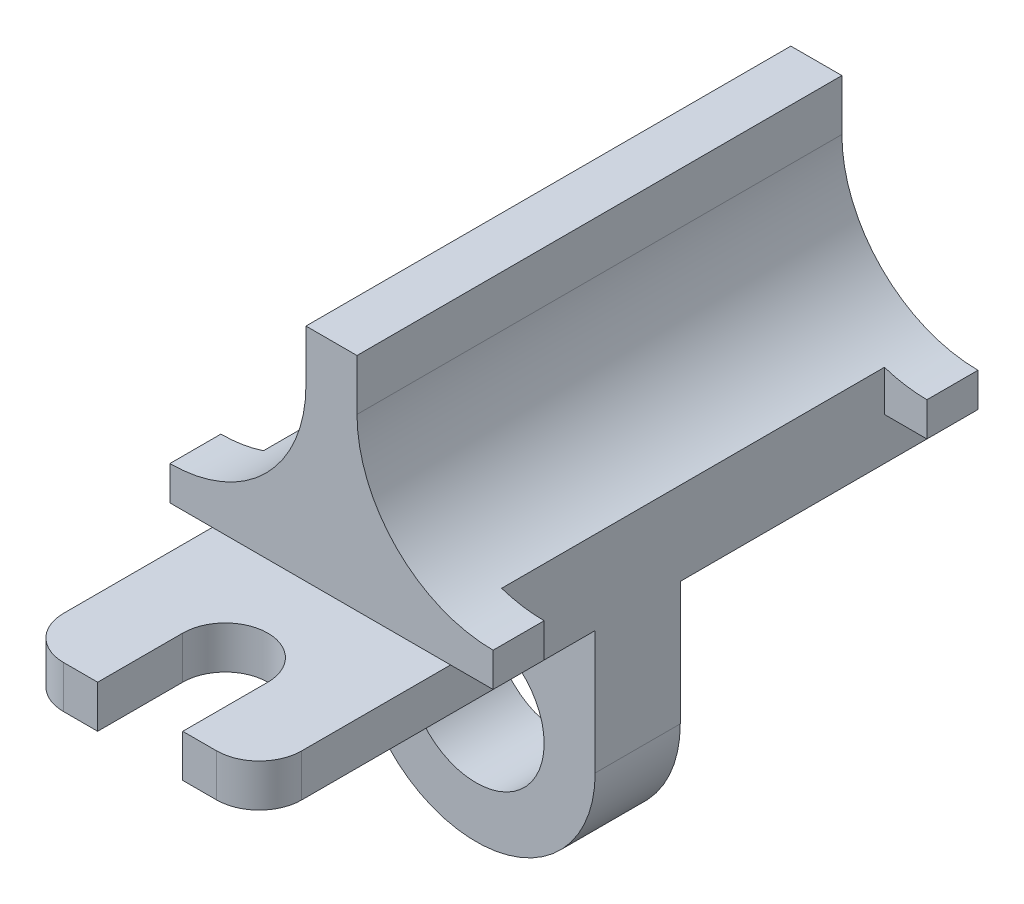
ISO-10303-21;
HEADER;
FILE_DESCRIPTION(('STEP AP214'),'2;1');
FILE_NAME('part.step','',(''),(''),'','','');
FILE_SCHEMA(('AUTOMOTIVE_DESIGN { 1 0 10303 214 1 1 1 1 }'));
ENDSEC;
DATA;
#1=APPLICATION_CONTEXT('core data for automotive mechanical design processes');
#2=APPLICATION_PROTOCOL_DEFINITION('international standard','automotive_design',2000,#1);
#3=PRODUCT_CONTEXT('',#1,'mechanical');
#4=PRODUCT('Part','Part','',(#3));
#5=PRODUCT_RELATED_PRODUCT_CATEGORY('part','',(#4));
#6=PRODUCT_DEFINITION_FORMATION('','',#4);
#7=PRODUCT_DEFINITION_CONTEXT('part definition',#1,'design');
#8=PRODUCT_DEFINITION('design','',#6,#7);
#9=PRODUCT_DEFINITION_SHAPE('','',#8);
#10=(LENGTH_UNIT() NAMED_UNIT(*) SI_UNIT(.MILLI.,.METRE.));
#11=(NAMED_UNIT(*) PLANE_ANGLE_UNIT() SI_UNIT($,.RADIAN.));
#12=(NAMED_UNIT(*) SI_UNIT($,.STERADIAN.) SOLID_ANGLE_UNIT());
#13=UNCERTAINTY_MEASURE_WITH_UNIT(LENGTH_MEASURE(1.E-05),#10,'distance_accuracy_value','');
#14=(GEOMETRIC_REPRESENTATION_CONTEXT(3) GLOBAL_UNCERTAINTY_ASSIGNED_CONTEXT((#13)) GLOBAL_UNIT_ASSIGNED_CONTEXT((#10,
#11,#12)) REPRESENTATION_CONTEXT('',''));
#15=CARTESIAN_POINT('',(0.,0.,0.));
#16=DIRECTION('',(0.,0.,1.));
#17=DIRECTION('',(1.,0.,0.));
#18=AXIS2_PLACEMENT_3D('',#15,#16,#17);
#19=CARTESIAN_POINT('',(66.,39.,-70.));
#20=DIRECTION('',(0.,-1.,0.));
#21=DIRECTION('',(1.,0.,0.));
#22=AXIS2_PLACEMENT_3D('',#19,#20,#21);
#23=PLANE('',#22);
#24=DIRECTION('',(-1.,0.,0.));
#25=VECTOR('',#24,1.);
#26=CARTESIAN_POINT('',(56.,39.,32.));
#27=LINE('',#26,#25);
#28=CARTESIAN_POINT('',(66.,39.,32.));
#29=VERTEX_POINT('',#28);
#30=CARTESIAN_POINT('',(56.,39.,32.));
#31=VERTEX_POINT('',#30);
#32=EDGE_CURVE('E442',#29,#31,#27,.T.);
#33=ORIENTED_EDGE('',*,*,#32,.F.);
#34=DIRECTION('',(0.,0.,1.));
#35=VECTOR('',#34,1.);
#36=CARTESIAN_POINT('',(66.,39.,-70.));
#37=LINE('',#36,#35);
#38=CARTESIAN_POINT('',(66.,39.,44.));
#39=VERTEX_POINT('',#38);
#40=EDGE_CURVE('E429',#29,#39,#37,.T.);
#41=ORIENTED_EDGE('',*,*,#40,.T.);
#42=DIRECTION('',(1.,0.,0.));
#43=VECTOR('',#42,1.);
#44=CARTESIAN_POINT('',(66.,39.,44.));
#45=LINE('',#44,#43);
#46=CARTESIAN_POINT('',(56.,39.,44.));
#47=VERTEX_POINT('',#46);
#48=EDGE_CURVE('E402',#47,#39,#45,.T.);
#49=ORIENTED_EDGE('',*,*,#48,.F.);
#50=DIRECTION('',(0.,0.,1.));
#51=VECTOR('',#50,1.);
#52=CARTESIAN_POINT('',(56.,39.,-70.));
#53=LINE('',#52,#51);
#54=EDGE_CURVE('E299',#31,#47,#53,.T.);
#55=ORIENTED_EDGE('',*,*,#54,.F.);
#56=EDGE_LOOP('',(#33,#41,#49,#55));
#57=FACE_BOUND('',#56,.T.);
#58=ADVANCED_FACE('F32',(#57),#23,.T.);
#59=CARTESIAN_POINT('',(66.,39.,-70.));
#60=DIRECTION('',(1.,0.,0.));
#61=DIRECTION('',(0.,0.,-1.));
#62=AXIS2_PLACEMENT_3D('',#59,#60,#61);
#63=PLANE('',#62);
#64=DIRECTION('',(0.,-1.,0.));
#65=VECTOR('',#64,1.);
#66=CARTESIAN_POINT('',(66.,91.001,32.));
#67=LINE('',#66,#65);
#68=CARTESIAN_POINT('',(66.,47.,32.));
#69=VERTEX_POINT('',#68);
#70=EDGE_CURVE('E452',#69,#29,#67,.T.);
#71=ORIENTED_EDGE('',*,*,#70,.F.);
#72=DIRECTION('',(0.,0.,1.));
#73=VECTOR('',#72,1.);
#74=CARTESIAN_POINT('',(66.,47.,-70.));
#75=LINE('',#74,#73);
#76=CARTESIAN_POINT('',(66.,47.,44.));
#77=VERTEX_POINT('',#76);
#78=EDGE_CURVE('E274',#69,#77,#75,.T.);
#79=ORIENTED_EDGE('',*,*,#78,.T.);
#80=DIRECTION('',(0.,1.,0.));
#81=VECTOR('',#80,1.);
#82=CARTESIAN_POINT('',(66.,39.,44.));
#83=LINE('',#82,#81);
#84=EDGE_CURVE('E380',#39,#77,#83,.T.);
#85=ORIENTED_EDGE('',*,*,#84,.F.);
#86=ORIENTED_EDGE('',*,*,#40,.F.);
#87=EDGE_LOOP('',(#71,#79,#85,#86));
#88=FACE_BOUND('',#87,.T.);
#89=ADVANCED_FACE('F449',(#88),#63,.T.);
#90=DIRECTION('',(-1.,0.,0.));
#91=VECTOR('',#90,1.);
#92=CARTESIAN_POINT('',(-10.,39.,32.));
#93=LINE('',#92,#91);
#94=CARTESIAN_POINT('',(0.,39.,32.));
#95=VERTEX_POINT('',#94);
#96=CARTESIAN_POINT('',(-10.,39.,32.));
#97=VERTEX_POINT('',#96);
#98=EDGE_CURVE('E250',#95,#97,#93,.T.);
#99=ORIENTED_EDGE('',*,*,#98,.F.);
#100=DIRECTION('',(0.,0.,1.));
#101=VECTOR('',#100,1.);
#102=CARTESIAN_POINT('',(0.,39.,-70.));
#103=LINE('',#102,#101);
#104=CARTESIAN_POINT('',(0.,39.,44.));
#105=VERTEX_POINT('',#104);
#106=EDGE_CURVE('E294',#95,#105,#103,.T.);
#107=ORIENTED_EDGE('',*,*,#106,.T.);
#108=CARTESIAN_POINT('',(-10.,39.,44.));
#109=VERTEX_POINT('',#108);
#110=EDGE_CURVE('E403',#109,#105,#45,.T.);
#111=ORIENTED_EDGE('',*,*,#110,.F.);
#112=DIRECTION('',(0.,0.,1.));
#113=VECTOR('',#112,1.);
#114=CARTESIAN_POINT('',(-10.,39.,-70.));
#115=LINE('',#114,#113);
#116=EDGE_CURVE('E257',#97,#109,#115,.T.);
#117=ORIENTED_EDGE('',*,*,#116,.F.);
#118=EDGE_LOOP('',(#99,#107,#111,#117));
#119=FACE_BOUND('',#118,.T.);
#120=ADVANCED_FACE('F483',(#119),#23,.T.);
#121=CARTESIAN_POINT('',(-10.,39.,-70.));
#122=DIRECTION('',(-1.,0.,0.));
#123=DIRECTION('',(0.,-1.,0.));
#124=AXIS2_PLACEMENT_3D('',#121,#122,#123);
#125=PLANE('',#124);
#126=DIRECTION('',(0.,-1.,0.));
#127=VECTOR('',#126,1.);
#128=CARTESIAN_POINT('',(-10.,91.001,32.));
#129=LINE('',#128,#127);
#130=CARTESIAN_POINT('',(-10.,47.,32.));
#131=VERTEX_POINT('',#130);
#132=EDGE_CURVE('E241',#131,#97,#129,.T.);
#133=ORIENTED_EDGE('',*,*,#132,.T.);
#134=ORIENTED_EDGE('',*,*,#116,.T.);
#135=DIRECTION('',(0.,-1.,0.));
#136=VECTOR('',#135,1.);
#137=CARTESIAN_POINT('',(-10.,39.,44.));
#138=LINE('',#137,#136);
#139=CARTESIAN_POINT('',(-10.,47.,44.));
#140=VERTEX_POINT('',#139);
#141=EDGE_CURVE('E399',#140,#109,#138,.T.);
#142=ORIENTED_EDGE('',*,*,#141,.F.);
#143=DIRECTION('',(0.,0.,1.));
#144=VECTOR('',#143,1.);
#145=CARTESIAN_POINT('',(-10.,47.,-70.));
#146=LINE('',#145,#144);
#147=EDGE_CURVE('E258',#131,#140,#146,.T.);
#148=ORIENTED_EDGE('',*,*,#147,.F.);
#149=EDGE_LOOP('',(#133,#134,#142,#148));
#150=FACE_BOUND('',#149,.T.);
#151=ADVANCED_FACE('F478',(#150),#125,.T.);
#152=CARTESIAN_POINT('',(0.,0.,89.));
#153=DIRECTION('',(0.,0.,1.));
#154=DIRECTION('',(1.,0.,0.));
#155=AXIS2_PLACEMENT_3D('',#152,#153,#154);
#156=PLANE('',#155);
#157=DIRECTION('',(1.,0.,0.));
#158=VECTOR('',#157,1.);
#159=CARTESIAN_POINT('',(0.,29.,89.));
#160=LINE('',#159,#158);
#161=CARTESIAN_POINT('',(38.0334699329501,29.,89.));
#162=VERTEX_POINT('',#161);
#163=CARTESIAN_POINT('',(46.,29.,89.));
#164=VERTEX_POINT('',#163);
#165=EDGE_CURVE('E278',#162,#164,#160,.T.);
#166=ORIENTED_EDGE('',*,*,#165,.T.);
#167=DIRECTION('',(0.,-1.,0.));
#168=VECTOR('',#167,1.);
#169=CARTESIAN_POINT('',(46.,39.,89.));
#170=LINE('',#169,#168);
#171=CARTESIAN_POINT('',(46.,39.,89.));
#172=VERTEX_POINT('',#171);
#173=EDGE_CURVE('E315',#164,#172,#170,.F.);
#174=ORIENTED_EDGE('',*,*,#173,.T.);
#175=DIRECTION('',(1.,0.,0.));
#176=VECTOR('',#175,1.);
#177=CARTESIAN_POINT('',(0.,39.,89.));
#178=LINE('',#177,#176);
#179=CARTESIAN_POINT('',(38.0334699329501,39.,89.));
#180=VERTEX_POINT('',#179);
#181=EDGE_CURVE('E277',#180,#172,#178,.T.);
#182=ORIENTED_EDGE('',*,*,#181,.F.);
#183=DIRECTION('',(0.,1.,0.));
#184=VECTOR('',#183,1.);
#185=CARTESIAN_POINT('',(38.0334699329501,-28.001,89.));
#186=LINE('',#185,#184);
#187=EDGE_CURVE('E347',#162,#180,#186,.T.);
#188=ORIENTED_EDGE('',*,*,#187,.F.);
#189=EDGE_LOOP('',(#166,#174,#182,#188));
#190=FACE_BOUND('',#189,.T.);
#191=ADVANCED_FACE('F576',(#190),#156,.T.);
#192=CARTESIAN_POINT('',(0.,29.,-70.));
#193=DIRECTION('',(0.,-1.,0.));
#194=DIRECTION('',(0.,0.,-1.));
#195=AXIS2_PLACEMENT_3D('',#192,#193,#194);
#196=PLANE('',#195);
#197=DIRECTION('',(0.,0.,1.));
#198=VECTOR('',#197,1.);
#199=CARTESIAN_POINT('',(56.,29.,-70.));
#200=LINE('',#199,#198);
#201=CARTESIAN_POINT('',(56.,29.,-70.));
#202=VERTEX_POINT('',#201);
#203=CARTESIAN_POINT('',(56.,29.,-10.));
#204=VERTEX_POINT('',#203);
#205=EDGE_CURVE('E301',#202,#204,#200,.T.);
#206=ORIENTED_EDGE('',*,*,#205,.T.);
#207=DIRECTION('',(-1.,0.,0.));
#208=VECTOR('',#207,1.);
#209=CARTESIAN_POINT('',(0.,29.,-10.));
#210=LINE('',#209,#208);
#211=CARTESIAN_POINT('',(0.,29.,-10.));
#212=VERTEX_POINT('',#211);
#213=EDGE_CURVE('E371',#204,#212,#210,.T.);
#214=ORIENTED_EDGE('',*,*,#213,.T.);
#215=DIRECTION('',(0.,0.,1.));
#216=VECTOR('',#215,1.);
#217=CARTESIAN_POINT('',(0.,29.,-70.));
#218=LINE('',#217,#216);
#219=CARTESIAN_POINT('',(0.,29.,-70.));
#220=VERTEX_POINT('',#219);
#221=EDGE_CURVE('E305',#220,#212,#218,.T.);
#222=ORIENTED_EDGE('',*,*,#221,.F.);
#223=DIRECTION('',(1.,0.,0.));
#224=VECTOR('',#223,1.);
#225=CARTESIAN_POINT('',(0.,29.,-70.));
#226=LINE('',#225,#224);
#227=EDGE_CURVE('E284',#220,#202,#226,.T.);
#228=ORIENTED_EDGE('',*,*,#227,.T.);
#229=EDGE_LOOP('',(#206,#214,#222,#228));
#230=FACE_BOUND('',#229,.T.);
#231=ADVANCED_FACE('F642',(#230),#196,.T.);
#232=CARTESIAN_POINT('',(0.,39.,-70.));
#233=DIRECTION('',(0.,-1.,0.));
#234=DIRECTION('',(0.,0.,-1.));
#235=AXIS2_PLACEMENT_3D('',#232,#233,#234);
#236=PLANE('',#235);
#237=ORIENTED_EDGE('',*,*,#181,.T.);
#238=CARTESIAN_POINT('',(46.,39.,79.));
#239=DIRECTION('',(0.,-1.,0.));
#240=DIRECTION('',(0.,0.,-1.));
#241=AXIS2_PLACEMENT_3D('',#238,#239,#240);
#242=CIRCLE('',#241,10.);
#243=CARTESIAN_POINT('',(56.,39.,79.));
#244=VERTEX_POINT('',#243);
#245=EDGE_CURVE('E319',#172,#244,#242,.F.);
#246=ORIENTED_EDGE('',*,*,#245,.T.);
#247=EDGE_CURVE('E300',#47,#244,#53,.T.);
#248=ORIENTED_EDGE('',*,*,#247,.F.);
#249=EDGE_CURVE('E293',#105,#47,#45,.T.);
#250=ORIENTED_EDGE('',*,*,#249,.F.);
#251=CARTESIAN_POINT('',(0.,39.,79.));
#252=VERTEX_POINT('',#251);
#253=EDGE_CURVE('E295',#105,#252,#103,.T.);
#254=ORIENTED_EDGE('',*,*,#253,.T.);
#255=CARTESIAN_POINT('',(10.,39.,79.));
#256=DIRECTION('',(0.,-1.,0.));
#257=DIRECTION('',(0.,0.,-1.));
#258=AXIS2_PLACEMENT_3D('',#255,#256,#257);
#259=CIRCLE('',#258,10.);
#260=CARTESIAN_POINT('',(10.,39.,89.));
#261=VERTEX_POINT('',#260);
#262=EDGE_CURVE('E317',#252,#261,#259,.F.);
#263=ORIENTED_EDGE('',*,*,#262,.T.);
#264=CARTESIAN_POINT('',(18.0334699329501,39.,89.));
#265=VERTEX_POINT('',#264);
#266=EDGE_CURVE('E279',#261,#265,#178,.T.);
#267=ORIENTED_EDGE('',*,*,#266,.T.);
#268=DIRECTION('',(0.,0.,1.));
#269=VECTOR('',#268,1.);
#270=CARTESIAN_POINT('',(18.0334699329501,39.,89.));
#271=LINE('',#270,#269);
#272=CARTESIAN_POINT('',(18.0334699329501,39.,69.));
#273=VERTEX_POINT('',#272);
#274=EDGE_CURVE('E500',#273,#265,#271,.T.);
#275=ORIENTED_EDGE('',*,*,#274,.F.);
#276=CARTESIAN_POINT('',(28.0334699329501,39.,69.));
#277=DIRECTION('',(0.,1.,0.));
#278=DIRECTION('',(0.,0.,1.));
#279=AXIS2_PLACEMENT_3D('',#276,#277,#278);
#280=CIRCLE('',#279,10.);
#281=CARTESIAN_POINT('',(38.0334699329501,39.,69.));
#282=VERTEX_POINT('',#281);
#283=EDGE_CURVE('E505',#282,#273,#280,.T.);
#284=ORIENTED_EDGE('',*,*,#283,.F.);
#285=DIRECTION('',(0.,0.,-1.));
#286=VECTOR('',#285,1.);
#287=CARTESIAN_POINT('',(38.0334699329501,39.,69.));
#288=LINE('',#287,#286);
#289=EDGE_CURVE('E504',#180,#282,#288,.T.);
#290=ORIENTED_EDGE('',*,*,#289,.F.);
#291=EDGE_LOOP('',(#237,#246,#248,#250,#254,#263,#267,#275,#284,#290));
#292=FACE_BOUND('',#291,.T.);
#293=ADVANCED_FACE('F492',(#292),#236,.F.);
#294=CARTESIAN_POINT('',(0.,39.,-70.));
#295=DIRECTION('',(-1.,0.,0.));
#296=DIRECTION('',(0.,0.,1.));
#297=AXIS2_PLACEMENT_3D('',#294,#295,#296);
#298=PLANE('',#297);
#299=CARTESIAN_POINT('',(0.,29.,10.));
#300=VERTEX_POINT('',#299);
#301=CARTESIAN_POINT('',(0.,29.,79.));
#302=VERTEX_POINT('',#301);
#303=EDGE_CURVE('E289',#300,#302,#218,.T.);
#304=ORIENTED_EDGE('',*,*,#303,.T.);
#305=DIRECTION('',(0.,-1.,0.));
#306=VECTOR('',#305,1.);
#307=CARTESIAN_POINT('',(0.,39.,79.));
#308=LINE('',#307,#306);
#309=EDGE_CURVE('E11',#302,#252,#308,.F.);
#310=ORIENTED_EDGE('',*,*,#309,.T.);
#311=ORIENTED_EDGE('',*,*,#253,.F.);
#312=ORIENTED_EDGE('',*,*,#106,.F.);
#313=DIRECTION('',(0.,-1.,0.));
#314=VECTOR('',#313,1.);
#315=CARTESIAN_POINT('',(0.,91.001,32.));
#316=LINE('',#315,#314);
#317=CARTESIAN_POINT('',(0.,48.6026316928587,32.));
#318=VERTEX_POINT('',#317);
#319=EDGE_CURVE('E533',#318,#95,#316,.T.);
#320=ORIENTED_EDGE('',*,*,#319,.F.);
#321=DIRECTION('',(0.,0.,1.));
#322=VECTOR('',#321,1.);
#323=CARTESIAN_POINT('',(0.,48.6026316928587,-70.));
#324=LINE('',#323,#322);
#325=CARTESIAN_POINT('',(0.,48.6026316928587,-58.));
#326=VERTEX_POINT('',#325);
#327=EDGE_CURVE('E517',#326,#318,#324,.T.);
#328=ORIENTED_EDGE('',*,*,#327,.F.);
#329=DIRECTION('',(0.,-1.,0.));
#330=VECTOR('',#329,1.);
#331=CARTESIAN_POINT('',(0.,91.001,-58.));
#332=LINE('',#331,#330);
#333=CARTESIAN_POINT('',(0.,39.,-58.));
#334=VERTEX_POINT('',#333);
#335=EDGE_CURVE('E47',#326,#334,#332,.T.);
#336=ORIENTED_EDGE('',*,*,#335,.T.);
#337=CARTESIAN_POINT('',(0.,39.,-70.));
#338=VERTEX_POINT('',#337);
#339=EDGE_CURVE('E290',#338,#334,#103,.T.);
#340=ORIENTED_EDGE('',*,*,#339,.F.);
#341=DIRECTION('',(0.,-1.,0.));
#342=VECTOR('',#341,1.);
#343=CARTESIAN_POINT('',(0.,39.,-70.));
#344=LINE('',#343,#342);
#345=EDGE_CURVE('E281',#338,#220,#344,.T.);
#346=ORIENTED_EDGE('',*,*,#345,.T.);
#347=ORIENTED_EDGE('',*,*,#221,.T.);
#348=DIRECTION('',(0.,-1.,0.));
#349=VECTOR('',#348,1.);
#350=CARTESIAN_POINT('',(0.,0.,-10.));
#351=LINE('',#350,#349);
#352=CARTESIAN_POINT('',(0.,0.,-10.));
#353=VERTEX_POINT('',#352);
#354=EDGE_CURVE('E374',#212,#353,#351,.T.);
#355=ORIENTED_EDGE('',*,*,#354,.T.);
#356=DIRECTION('',(0.,0.,1.));
#357=VECTOR('',#356,1.);
#358=CARTESIAN_POINT('',(0.,0.,-10.));
#359=LINE('',#358,#357);
#360=CARTESIAN_POINT('',(0.,0.,10.));
#361=VERTEX_POINT('',#360);
#362=EDGE_CURVE('E378',#353,#361,#359,.T.);
#363=ORIENTED_EDGE('',*,*,#362,.T.);
#364=DIRECTION('',(0.,-1.,0.));
#365=VECTOR('',#364,1.);
#366=CARTESIAN_POINT('',(0.,0.,10.));
#367=LINE('',#366,#365);
#368=EDGE_CURVE('E359',#300,#361,#367,.T.);
#369=ORIENTED_EDGE('',*,*,#368,.F.);
#370=EDGE_LOOP('',(#304,#310,#311,#312,#320,#328,#336,#340,#346,#347,#355,#363,#369));
#371=FACE_BOUND('',#370,.T.);
#372=ADVANCED_FACE('F494',(#371),#298,.T.);
#373=CARTESIAN_POINT('',(56.,39.,-70.));
#374=DIRECTION('',(-1.,0.,0.));
#375=DIRECTION('',(0.,0.,1.));
#376=AXIS2_PLACEMENT_3D('',#373,#374,#375);
#377=PLANE('',#376);
#378=ORIENTED_EDGE('',*,*,#247,.T.);
#379=DIRECTION('',(0.,-1.,0.));
#380=VECTOR('',#379,1.);
#381=CARTESIAN_POINT('',(56.,29.,79.));
#382=LINE('',#381,#380);
#383=CARTESIAN_POINT('',(56.,29.,79.));
#384=VERTEX_POINT('',#383);
#385=EDGE_CURVE('E308',#244,#384,#382,.T.);
#386=ORIENTED_EDGE('',*,*,#385,.T.);
#387=CARTESIAN_POINT('',(56.,29.,10.));
#388=VERTEX_POINT('',#387);
#389=EDGE_CURVE('E304',#388,#384,#200,.T.);
#390=ORIENTED_EDGE('',*,*,#389,.F.);
#391=DIRECTION('',(0.,1.,0.));
#392=VECTOR('',#391,1.);
#393=CARTESIAN_POINT('',(56.,29.,10.));
#394=LINE('',#393,#392);
#395=CARTESIAN_POINT('',(56.,0.,10.));
#396=VERTEX_POINT('',#395);
#397=EDGE_CURVE('E355',#396,#388,#394,.T.);
#398=ORIENTED_EDGE('',*,*,#397,.F.);
#399=DIRECTION('',(0.,0.,1.));
#400=VECTOR('',#399,1.);
#401=CARTESIAN_POINT('',(56.,0.,-10.));
#402=LINE('',#401,#400);
#403=CARTESIAN_POINT('',(56.,0.,-10.));
#404=VERTEX_POINT('',#403);
#405=EDGE_CURVE('E377',#404,#396,#402,.T.);
#406=ORIENTED_EDGE('',*,*,#405,.F.);
#407=DIRECTION('',(0.,1.,0.));
#408=VECTOR('',#407,1.);
#409=CARTESIAN_POINT('',(56.,29.,-10.));
#410=LINE('',#409,#408);
#411=EDGE_CURVE('E368',#404,#204,#410,.T.);
#412=ORIENTED_EDGE('',*,*,#411,.T.);
#413=ORIENTED_EDGE('',*,*,#205,.F.);
#414=DIRECTION('',(0.,-1.,0.));
#415=VECTOR('',#414,1.);
#416=CARTESIAN_POINT('',(56.,39.,-70.));
#417=LINE('',#416,#415);
#418=CARTESIAN_POINT('',(56.,39.,-70.));
#419=VERTEX_POINT('',#418);
#420=EDGE_CURVE('E287',#419,#202,#417,.T.);
#421=ORIENTED_EDGE('',*,*,#420,.F.);
#422=CARTESIAN_POINT('',(56.,39.,-58.));
#423=VERTEX_POINT('',#422);
#424=EDGE_CURVE('E296',#419,#423,#53,.T.);
#425=ORIENTED_EDGE('',*,*,#424,.T.);
#426=DIRECTION('',(0.,-1.,0.));
#427=VECTOR('',#426,1.);
#428=CARTESIAN_POINT('',(56.,91.001,-58.));
#429=LINE('',#428,#427);
#430=CARTESIAN_POINT('',(56.,48.6026316928587,-58.));
#431=VERTEX_POINT('',#430);
#432=EDGE_CURVE('E519',#431,#423,#429,.T.);
#433=ORIENTED_EDGE('',*,*,#432,.F.);
#434=DIRECTION('',(0.,0.,1.));
#435=VECTOR('',#434,1.);
#436=CARTESIAN_POINT('',(56.,48.6026316928587,-70.));
#437=LINE('',#436,#435);
#438=CARTESIAN_POINT('',(56.,48.6026316928587,32.));
#439=VERTEX_POINT('',#438);
#440=EDGE_CURVE('E529',#439,#431,#437,.F.);
#441=ORIENTED_EDGE('',*,*,#440,.F.);
#442=DIRECTION('',(0.,-1.,0.));
#443=VECTOR('',#442,1.);
#444=CARTESIAN_POINT('',(56.,91.001,32.));
#445=LINE('',#444,#443);
#446=EDGE_CURVE('E518',#439,#31,#445,.T.);
#447=ORIENTED_EDGE('',*,*,#446,.T.);
#448=ORIENTED_EDGE('',*,*,#54,.T.);
#449=EDGE_LOOP('',(#378,#386,#390,#398,#406,#412,#413,#421,#425,#433,#441,#447,#448));
#450=FACE_BOUND('',#449,.T.);
#451=ADVANCED_FACE('F581',(#450),#377,.F.);
#452=ORIENTED_EDGE('',*,*,#389,.T.);
#453=CARTESIAN_POINT('',(46.,29.,79.));
#454=DIRECTION('',(0.,-1.,0.));
#455=DIRECTION('',(0.,0.,-1.));
#456=AXIS2_PLACEMENT_3D('',#453,#454,#455);
#457=CIRCLE('',#456,10.);
#458=EDGE_CURVE('E313',#384,#164,#457,.T.);
#459=ORIENTED_EDGE('',*,*,#458,.T.);
#460=ORIENTED_EDGE('',*,*,#165,.F.);
#461=DIRECTION('',(0.,0.,-1.));
#462=VECTOR('',#461,1.);
#463=CARTESIAN_POINT('',(38.0334699329501,29.,69.));
#464=LINE('',#463,#462);
#465=CARTESIAN_POINT('',(38.0334699329501,29.,69.));
#466=VERTEX_POINT('',#465);
#467=EDGE_CURVE('E512',#162,#466,#464,.T.);
#468=ORIENTED_EDGE('',*,*,#467,.T.);
#469=CARTESIAN_POINT('',(28.0334699329501,29.,69.));
#470=DIRECTION('',(0.,-1.,0.));
#471=DIRECTION('',(0.,0.,-1.));
#472=AXIS2_PLACEMENT_3D('',#469,#470,#471);
#473=CIRCLE('',#472,10.);
#474=CARTESIAN_POINT('',(18.0334699329501,29.,69.));
#475=VERTEX_POINT('',#474);
#476=EDGE_CURVE('E240',#466,#475,#473,.F.);
#477=ORIENTED_EDGE('',*,*,#476,.T.);
#478=DIRECTION('',(0.,0.,1.));
#479=VECTOR('',#478,1.);
#480=CARTESIAN_POINT('',(18.0334699329501,29.,89.));
#481=LINE('',#480,#479);
#482=CARTESIAN_POINT('',(18.0334699329501,29.,89.));
#483=VERTEX_POINT('',#482);
#484=EDGE_CURVE('E337',#475,#483,#481,.T.);
#485=ORIENTED_EDGE('',*,*,#484,.T.);
#486=CARTESIAN_POINT('',(10.,29.,89.));
#487=VERTEX_POINT('',#486);
#488=EDGE_CURVE('E275',#487,#483,#160,.T.);
#489=ORIENTED_EDGE('',*,*,#488,.F.);
#490=CARTESIAN_POINT('',(10.,29.,79.));
#491=DIRECTION('',(0.,-1.,0.));
#492=DIRECTION('',(0.,0.,-1.));
#493=AXIS2_PLACEMENT_3D('',#490,#491,#492);
#494=CIRCLE('',#493,10.);
#495=EDGE_CURVE('E311',#487,#302,#494,.T.);
#496=ORIENTED_EDGE('',*,*,#495,.T.);
#497=ORIENTED_EDGE('',*,*,#303,.F.);
#498=DIRECTION('',(-1.,0.,0.));
#499=VECTOR('',#498,1.);
#500=CARTESIAN_POINT('',(0.,29.,10.));
#501=LINE('',#500,#499);
#502=EDGE_CURVE('E357',#388,#300,#501,.T.);
#503=ORIENTED_EDGE('',*,*,#502,.F.);
#504=EDGE_LOOP('',(#452,#459,#460,#468,#477,#485,#489,#496,#497,#503));
#505=FACE_BOUND('',#504,.T.);
#506=ADVANCED_FACE('F333',(#505),#196,.T.);
#507=CARTESIAN_POINT('',(0.,0.,-70.));
#508=DIRECTION('',(0.,0.,1.));
#509=DIRECTION('',(1.,0.,0.));
#510=AXIS2_PLACEMENT_3D('',#507,#508,#509);
#511=PLANE('',#510);
#512=ORIENTED_EDGE('',*,*,#345,.F.);
#513=DIRECTION('',(1.,0.,0.));
#514=VECTOR('',#513,1.);
#515=CARTESIAN_POINT('',(66.,39.,-70.));
#516=LINE('',#515,#514);
#517=CARTESIAN_POINT('',(-10.,39.,-70.));
#518=VERTEX_POINT('',#517);
#519=EDGE_CURVE('E425',#518,#338,#516,.T.);
#520=ORIENTED_EDGE('',*,*,#519,.F.);
#521=DIRECTION('',(0.,-1.,0.));
#522=VECTOR('',#521,1.);
#523=CARTESIAN_POINT('',(-10.,39.,-70.));
#524=LINE('',#523,#522);
#525=CARTESIAN_POINT('',(-10.,47.,-70.));
#526=VERTEX_POINT('',#525);
#527=EDGE_CURVE('E422',#526,#518,#524,.T.);
#528=ORIENTED_EDGE('',*,*,#527,.F.);
#529=CARTESIAN_POINT('',(-10.,79.,-70.));
#530=DIRECTION('',(0.,0.,-1.));
#531=DIRECTION('',(-1.,0.,0.));
#532=AXIS2_PLACEMENT_3D('',#529,#530,#531);
#533=CIRCLE('',#532,32.);
#534=CARTESIAN_POINT('',(22.,79.,-70.));
#535=VERTEX_POINT('',#534);
#536=EDGE_CURVE('E256',#535,#526,#533,.T.);
#537=ORIENTED_EDGE('',*,*,#536,.F.);
#538=DIRECTION('',(0.,-1.,0.));
#539=VECTOR('',#538,1.);
#540=CARTESIAN_POINT('',(22.,79.,-70.));
#541=LINE('',#540,#539);
#542=CARTESIAN_POINT('',(22.,91.,-70.));
#543=VERTEX_POINT('',#542);
#544=EDGE_CURVE('E418',#543,#535,#541,.T.);
#545=ORIENTED_EDGE('',*,*,#544,.F.);
#546=DIRECTION('',(-1.,0.,0.));
#547=VECTOR('',#546,1.);
#548=CARTESIAN_POINT('',(34.,91.,-70.));
#549=LINE('',#548,#547);
#550=CARTESIAN_POINT('',(34.,91.,-70.));
#551=VERTEX_POINT('',#550);
#552=EDGE_CURVE('E415',#551,#543,#549,.T.);
#553=ORIENTED_EDGE('',*,*,#552,.F.);
#554=DIRECTION('',(0.,1.,0.));
#555=VECTOR('',#554,1.);
#556=CARTESIAN_POINT('',(34.,79.,-70.));
#557=LINE('',#556,#555);
#558=CARTESIAN_POINT('',(34.,79.,-70.));
#559=VERTEX_POINT('',#558);
#560=EDGE_CURVE('E412',#559,#551,#557,.T.);
#561=ORIENTED_EDGE('',*,*,#560,.F.);
#562=CARTESIAN_POINT('',(66.,79.,-70.));
#563=DIRECTION('',(0.,0.,-1.));
#564=DIRECTION('',(-1.,0.,0.));
#565=AXIS2_PLACEMENT_3D('',#562,#563,#564);
#566=CIRCLE('',#565,32.);
#567=CARTESIAN_POINT('',(66.,47.,-70.));
#568=VERTEX_POINT('',#567);
#569=EDGE_CURVE('E409',#568,#559,#566,.T.);
#570=ORIENTED_EDGE('',*,*,#569,.F.);
#571=DIRECTION('',(0.,1.,0.));
#572=VECTOR('',#571,1.);
#573=CARTESIAN_POINT('',(66.,39.,-70.));
#574=LINE('',#573,#572);
#575=CARTESIAN_POINT('',(66.,39.,-70.));
#576=VERTEX_POINT('',#575);
#577=EDGE_CURVE('E406',#576,#568,#574,.T.);
#578=ORIENTED_EDGE('',*,*,#577,.F.);
#579=EDGE_CURVE('E424',#419,#576,#516,.T.);
#580=ORIENTED_EDGE('',*,*,#579,.F.);
#581=ORIENTED_EDGE('',*,*,#420,.T.);
#582=ORIENTED_EDGE('',*,*,#227,.F.);
#583=EDGE_LOOP('',(#512,#520,#528,#537,#545,#553,#561,#570,#578,#580,#581,#582));
#584=FACE_BOUND('',#583,.T.);
#585=ADVANCED_FACE('F467',(#584),#511,.F.);
#586=ORIENTED_EDGE('',*,*,#266,.F.);
#587=DIRECTION('',(0.,-1.,0.));
#588=VECTOR('',#587,1.);
#589=CARTESIAN_POINT('',(10.,0.,89.));
#590=LINE('',#589,#588);
#591=EDGE_CURVE('E40',#261,#487,#590,.T.);
#592=ORIENTED_EDGE('',*,*,#591,.T.);
#593=ORIENTED_EDGE('',*,*,#488,.T.);
#594=DIRECTION('',(0.,1.,0.));
#595=VECTOR('',#594,1.);
#596=CARTESIAN_POINT('',(18.0334699329501,-28.001,89.));
#597=LINE('',#596,#595);
#598=EDGE_CURVE('E502',#483,#265,#597,.T.);
#599=ORIENTED_EDGE('',*,*,#598,.T.);
#600=EDGE_LOOP('',(#586,#592,#593,#599));
#601=FACE_BOUND('',#600,.T.);
#602=ADVANCED_FACE('F325',(#601),#156,.T.);
#603=DIRECTION('',(1.,0.,0.));
#604=VECTOR('',#603,1.);
#605=CARTESIAN_POINT('',(56.,39.,-58.));
#606=LINE('',#605,#604);
#607=CARTESIAN_POINT('',(66.,39.,-58.));
#608=VERTEX_POINT('',#607);
#609=EDGE_CURVE('E525',#423,#608,#606,.T.);
#610=ORIENTED_EDGE('',*,*,#609,.F.);
#611=ORIENTED_EDGE('',*,*,#424,.F.);
#612=ORIENTED_EDGE('',*,*,#579,.T.);
#613=EDGE_CURVE('E427',#576,#608,#37,.T.);
#614=ORIENTED_EDGE('',*,*,#613,.T.);
#615=EDGE_LOOP('',(#610,#611,#612,#614));
#616=FACE_BOUND('',#615,.T.);
#617=ADVANCED_FACE('F563',(#616),#23,.T.);
#618=DIRECTION('',(0.,-1.,0.));
#619=VECTOR('',#618,1.);
#620=CARTESIAN_POINT('',(66.,91.001,-58.));
#621=LINE('',#620,#619);
#622=CARTESIAN_POINT('',(66.,47.,-58.));
#623=VERTEX_POINT('',#622);
#624=EDGE_CURVE('E55',#623,#608,#621,.T.);
#625=ORIENTED_EDGE('',*,*,#624,.T.);
#626=ORIENTED_EDGE('',*,*,#613,.F.);
#627=ORIENTED_EDGE('',*,*,#577,.T.);
#628=EDGE_CURVE('E271',#568,#623,#75,.T.);
#629=ORIENTED_EDGE('',*,*,#628,.T.);
#630=EDGE_LOOP('',(#625,#626,#627,#629));
#631=FACE_BOUND('',#630,.T.);
#632=ADVANCED_FACE('F559',(#631),#63,.T.);
#633=DIRECTION('',(1.,0.,0.));
#634=VECTOR('',#633,1.);
#635=CARTESIAN_POINT('',(-10.,39.,-58.));
#636=LINE('',#635,#634);
#637=CARTESIAN_POINT('',(-10.,39.,-58.));
#638=VERTEX_POINT('',#637);
#639=EDGE_CURVE('E537',#638,#334,#636,.T.);
#640=ORIENTED_EDGE('',*,*,#639,.F.);
#641=EDGE_CURVE('E249',#518,#638,#115,.T.);
#642=ORIENTED_EDGE('',*,*,#641,.F.);
#643=ORIENTED_EDGE('',*,*,#519,.T.);
#644=ORIENTED_EDGE('',*,*,#339,.T.);
#645=EDGE_LOOP('',(#640,#642,#643,#644));
#646=FACE_BOUND('',#645,.T.);
#647=ADVANCED_FACE('F554',(#646),#23,.T.);
#648=DIRECTION('',(0.,-1.,0.));
#649=VECTOR('',#648,1.);
#650=CARTESIAN_POINT('',(-10.,91.001,-58.));
#651=LINE('',#650,#649);
#652=CARTESIAN_POINT('',(-10.,47.,-58.));
#653=VERTEX_POINT('',#652);
#654=EDGE_CURVE('E235',#653,#638,#651,.T.);
#655=ORIENTED_EDGE('',*,*,#654,.F.);
#656=EDGE_CURVE('E247',#526,#653,#146,.T.);
#657=ORIENTED_EDGE('',*,*,#656,.F.);
#658=ORIENTED_EDGE('',*,*,#527,.T.);
#659=ORIENTED_EDGE('',*,*,#641,.T.);
#660=EDGE_LOOP('',(#655,#657,#658,#659));
#661=FACE_BOUND('',#660,.T.);
#662=ADVANCED_FACE('F245',(#661),#125,.T.);
#663=CARTESIAN_POINT('',(-10.,79.,-70.));
#664=DIRECTION('',(0.,0.,1.));
#665=DIRECTION('',(1.,0.,0.));
#666=AXIS2_PLACEMENT_3D('',#663,#664,#665);
#667=CYLINDRICAL_SURFACE('',#666,32.);
#668=CARTESIAN_POINT('',(-10.,79.,32.));
#669=DIRECTION('',(0.,0.,1.));
#670=DIRECTION('',(1.,0.,0.));
#671=AXIS2_PLACEMENT_3D('',#668,#669,#670);
#672=CIRCLE('',#671,32.);
#673=EDGE_CURVE('E475',#318,#131,#672,.F.);
#674=ORIENTED_EDGE('',*,*,#673,.T.);
#675=ORIENTED_EDGE('',*,*,#147,.T.);
#676=CARTESIAN_POINT('',(-10.,79.,44.));
#677=DIRECTION('',(0.,0.,-1.));
#678=DIRECTION('',(-1.,0.,0.));
#679=AXIS2_PLACEMENT_3D('',#676,#677,#678);
#680=CIRCLE('',#679,32.);
#681=CARTESIAN_POINT('',(22.,79.,44.));
#682=VERTEX_POINT('',#681);
#683=EDGE_CURVE('E396',#682,#140,#680,.T.);
#684=ORIENTED_EDGE('',*,*,#683,.F.);
#685=DIRECTION('',(0.,0.,1.));
#686=VECTOR('',#685,1.);
#687=CARTESIAN_POINT('',(22.,79.,-70.));
#688=LINE('',#687,#686);
#689=EDGE_CURVE('E261',#535,#682,#688,.T.);
#690=ORIENTED_EDGE('',*,*,#689,.F.);
#691=ORIENTED_EDGE('',*,*,#536,.T.);
#692=ORIENTED_EDGE('',*,*,#656,.T.);
#693=CARTESIAN_POINT('',(-10.,79.,-58.));
#694=DIRECTION('',(0.,0.,-1.));
#695=DIRECTION('',(-1.,0.,0.));
#696=AXIS2_PLACEMENT_3D('',#693,#694,#695);
#697=CIRCLE('',#696,32.);
#698=EDGE_CURVE('E232',#653,#326,#697,.F.);
#699=ORIENTED_EDGE('',*,*,#698,.T.);
#700=ORIENTED_EDGE('',*,*,#327,.T.);
#701=EDGE_LOOP('',(#674,#675,#684,#690,#691,#692,#699,#700));
#702=FACE_BOUND('',#701,.T.);
#703=ADVANCED_FACE('F254',(#702),#667,.F.);
#704=CARTESIAN_POINT('',(22.,79.,-70.));
#705=DIRECTION('',(-1.,0.,0.));
#706=DIRECTION('',(0.,0.,1.));
#707=AXIS2_PLACEMENT_3D('',#704,#705,#706);
#708=PLANE('',#707);
#709=ORIENTED_EDGE('',*,*,#689,.T.);
#710=DIRECTION('',(0.,-1.,0.));
#711=VECTOR('',#710,1.);
#712=CARTESIAN_POINT('',(22.,79.,44.));
#713=LINE('',#712,#711);
#714=CARTESIAN_POINT('',(22.,91.,44.));
#715=VERTEX_POINT('',#714);
#716=EDGE_CURVE('E393',#715,#682,#713,.T.);
#717=ORIENTED_EDGE('',*,*,#716,.F.);
#718=DIRECTION('',(0.,0.,1.));
#719=VECTOR('',#718,1.);
#720=CARTESIAN_POINT('',(22.,91.,-70.));
#721=LINE('',#720,#719);
#722=EDGE_CURVE('E265',#543,#715,#721,.T.);
#723=ORIENTED_EDGE('',*,*,#722,.F.);
#724=ORIENTED_EDGE('',*,*,#544,.T.);
#725=EDGE_LOOP('',(#709,#717,#723,#724));
#726=FACE_BOUND('',#725,.T.);
#727=ADVANCED_FACE('F470',(#726),#708,.T.);
#728=CARTESIAN_POINT('',(34.,91.,-70.));
#729=DIRECTION('',(0.,1.,0.));
#730=DIRECTION('',(0.,0.,1.));
#731=AXIS2_PLACEMENT_3D('',#728,#729,#730);
#732=PLANE('',#731);
#733=ORIENTED_EDGE('',*,*,#722,.T.);
#734=DIRECTION('',(-1.,0.,0.));
#735=VECTOR('',#734,1.);
#736=CARTESIAN_POINT('',(34.,91.,44.));
#737=LINE('',#736,#735);
#738=CARTESIAN_POINT('',(34.,91.,44.));
#739=VERTEX_POINT('',#738);
#740=EDGE_CURVE('E390',#739,#715,#737,.T.);
#741=ORIENTED_EDGE('',*,*,#740,.F.);
#742=DIRECTION('',(0.,0.,1.));
#743=VECTOR('',#742,1.);
#744=CARTESIAN_POINT('',(34.,91.,-70.));
#745=LINE('',#744,#743);
#746=EDGE_CURVE('E267',#551,#739,#745,.T.);
#747=ORIENTED_EDGE('',*,*,#746,.F.);
#748=ORIENTED_EDGE('',*,*,#552,.T.);
#749=EDGE_LOOP('',(#733,#741,#747,#748));
#750=FACE_BOUND('',#749,.T.);
#751=ADVANCED_FACE('F463',(#750),#732,.T.);
#752=CARTESIAN_POINT('',(34.,79.,-70.));
#753=DIRECTION('',(1.,0.,0.));
#754=DIRECTION('',(0.,0.,-1.));
#755=AXIS2_PLACEMENT_3D('',#752,#753,#754);
#756=PLANE('',#755);
#757=ORIENTED_EDGE('',*,*,#746,.T.);
#758=DIRECTION('',(0.,1.,0.));
#759=VECTOR('',#758,1.);
#760=CARTESIAN_POINT('',(34.,79.,44.));
#761=LINE('',#760,#759);
#762=CARTESIAN_POINT('',(34.,79.,44.));
#763=VERTEX_POINT('',#762);
#764=EDGE_CURVE('E387',#763,#739,#761,.T.);
#765=ORIENTED_EDGE('',*,*,#764,.F.);
#766=DIRECTION('',(0.,0.,1.));
#767=VECTOR('',#766,1.);
#768=CARTESIAN_POINT('',(34.,79.,-70.));
#769=LINE('',#768,#767);
#770=EDGE_CURVE('E269',#559,#763,#769,.T.);
#771=ORIENTED_EDGE('',*,*,#770,.F.);
#772=ORIENTED_EDGE('',*,*,#560,.T.);
#773=EDGE_LOOP('',(#757,#765,#771,#772));
#774=FACE_BOUND('',#773,.T.);
#775=ADVANCED_FACE('F459',(#774),#756,.T.);
#776=CARTESIAN_POINT('',(66.,79.,-70.));
#777=DIRECTION('',(0.,0.,1.));
#778=DIRECTION('',(1.,0.,0.));
#779=AXIS2_PLACEMENT_3D('',#776,#777,#778);
#780=CYLINDRICAL_SURFACE('',#779,32.);
#781=CARTESIAN_POINT('',(66.,79.,32.));
#782=DIRECTION('',(0.,0.,1.));
#783=DIRECTION('',(1.,0.,0.));
#784=AXIS2_PLACEMENT_3D('',#781,#782,#783);
#785=CIRCLE('',#784,32.);
#786=EDGE_CURVE('E527',#69,#439,#785,.F.);
#787=ORIENTED_EDGE('',*,*,#786,.T.);
#788=ORIENTED_EDGE('',*,*,#440,.T.);
#789=CARTESIAN_POINT('',(66.,79.,-58.));
#790=DIRECTION('',(0.,0.,-1.));
#791=DIRECTION('',(-1.,0.,0.));
#792=AXIS2_PLACEMENT_3D('',#789,#790,#791);
#793=CIRCLE('',#792,32.);
#794=EDGE_CURVE('E515',#431,#623,#793,.F.);
#795=ORIENTED_EDGE('',*,*,#794,.T.);
#796=ORIENTED_EDGE('',*,*,#628,.F.);
#797=ORIENTED_EDGE('',*,*,#569,.T.);
#798=ORIENTED_EDGE('',*,*,#770,.T.);
#799=CARTESIAN_POINT('',(66.,79.,44.));
#800=DIRECTION('',(0.,0.,-1.));
#801=DIRECTION('',(-1.,0.,0.));
#802=AXIS2_PLACEMENT_3D('',#799,#800,#801);
#803=CIRCLE('',#802,32.);
#804=EDGE_CURVE('E384',#77,#763,#803,.T.);
#805=ORIENTED_EDGE('',*,*,#804,.F.);
#806=ORIENTED_EDGE('',*,*,#78,.F.);
#807=EDGE_LOOP('',(#787,#788,#795,#796,#797,#798,#805,#806));
#808=FACE_BOUND('',#807,.T.);
#809=ADVANCED_FACE('F455',(#808),#780,.F.);
#810=CARTESIAN_POINT('',(66.,79.,44.));
#811=DIRECTION('',(0.,0.,-1.));
#812=DIRECTION('',(-1.,0.,0.));
#813=AXIS2_PLACEMENT_3D('',#810,#811,#812);
#814=PLANE('',#813);
#815=ORIENTED_EDGE('',*,*,#84,.T.);
#816=ORIENTED_EDGE('',*,*,#804,.T.);
#817=ORIENTED_EDGE('',*,*,#764,.T.);
#818=ORIENTED_EDGE('',*,*,#740,.T.);
#819=ORIENTED_EDGE('',*,*,#716,.T.);
#820=ORIENTED_EDGE('',*,*,#683,.T.);
#821=ORIENTED_EDGE('',*,*,#141,.T.);
#822=ORIENTED_EDGE('',*,*,#110,.T.);
#823=ORIENTED_EDGE('',*,*,#249,.T.);
#824=ORIENTED_EDGE('',*,*,#48,.T.);
#825=EDGE_LOOP('',(#815,#816,#817,#818,#819,#820,#821,#822,#823,#824));
#826=FACE_BOUND('',#825,.T.);
#827=ADVANCED_FACE('F447',(#826),#814,.F.);
#828=CARTESIAN_POINT('',(28.,0.,-10.));
#829=DIRECTION('',(0.,0.,1.));
#830=DIRECTION('',(1.,0.,0.));
#831=AXIS2_PLACEMENT_3D('',#828,#829,#830);
#832=CYLINDRICAL_SURFACE('',#831,28.);
#833=ORIENTED_EDGE('',*,*,#405,.T.);
#834=CARTESIAN_POINT('',(28.,0.,10.));
#835=DIRECTION('',(0.,0.,1.));
#836=DIRECTION('',(-1.,0.,0.));
#837=AXIS2_PLACEMENT_3D('',#834,#835,#836);
#838=CIRCLE('',#837,28.);
#839=EDGE_CURVE('E345',#361,#396,#838,.T.);
#840=ORIENTED_EDGE('',*,*,#839,.F.);
#841=ORIENTED_EDGE('',*,*,#362,.F.);
#842=CARTESIAN_POINT('',(28.,0.,-10.));
#843=DIRECTION('',(0.,0.,1.));
#844=DIRECTION('',(-1.,0.,0.));
#845=AXIS2_PLACEMENT_3D('',#842,#843,#844);
#846=CIRCLE('',#845,28.);
#847=EDGE_CURVE('E365',#353,#404,#846,.T.);
#848=ORIENTED_EDGE('',*,*,#847,.T.);
#849=EDGE_LOOP('',(#833,#840,#841,#848));
#850=FACE_BOUND('',#849,.T.);
#851=ADVANCED_FACE('F623',(#850),#832,.T.);
#852=CARTESIAN_POINT('',(28.,0.,-10.));
#853=DIRECTION('',(0.,0.,-1.));
#854=DIRECTION('',(-1.,0.,0.));
#855=AXIS2_PLACEMENT_3D('',#852,#853,#854);
#856=PLANE('',#855);
#857=CARTESIAN_POINT('',(28.,0.,-10.));
#858=DIRECTION('',(0.,0.,1.));
#859=DIRECTION('',(1.,0.,0.));
#860=AXIS2_PLACEMENT_3D('',#857,#858,#859);
#861=CIRCLE('',#860,16.);
#862=CARTESIAN_POINT('',(44.,0.,-10.));
#863=VERTEX_POINT('',#862);
#864=EDGE_CURVE('E362',#863,#863,#861,.T.);
#865=ORIENTED_EDGE('',*,*,#864,.T.);
#866=EDGE_LOOP('',(#865));
#867=FACE_BOUND('',#866,.T.);
#868=ORIENTED_EDGE('',*,*,#847,.F.);
#869=ORIENTED_EDGE('',*,*,#354,.F.);
#870=ORIENTED_EDGE('',*,*,#213,.F.);
#871=ORIENTED_EDGE('',*,*,#411,.F.);
#872=EDGE_LOOP('',(#868,#869,#870,#871));
#873=FACE_BOUND('',#872,.T.);
#874=ADVANCED_FACE('F619',(#867,#873),#856,.T.);
#875=CARTESIAN_POINT('',(28.,0.,-10.));
#876=DIRECTION('',(0.,0.,1.));
#877=DIRECTION('',(1.,0.,0.));
#878=AXIS2_PLACEMENT_3D('',#875,#876,#877);
#879=CYLINDRICAL_SURFACE('',#878,16.);
#880=ORIENTED_EDGE('',*,*,#864,.F.);
#881=EDGE_LOOP('',(#880));
#882=FACE_BOUND('',#881,.T.);
#883=CARTESIAN_POINT('',(28.,0.,10.));
#884=DIRECTION('',(0.,0.,1.));
#885=DIRECTION('',(1.,0.,0.));
#886=AXIS2_PLACEMENT_3D('',#883,#884,#885);
#887=CIRCLE('',#886,16.);
#888=CARTESIAN_POINT('',(44.,0.,10.));
#889=VERTEX_POINT('',#888);
#890=EDGE_CURVE('E341',#889,#889,#887,.T.);
#891=ORIENTED_EDGE('',*,*,#890,.T.);
#892=EDGE_LOOP('',(#891));
#893=FACE_BOUND('',#892,.T.);
#894=ADVANCED_FACE('F612',(#882,#893),#879,.F.);
#895=CARTESIAN_POINT('',(28.,0.,10.));
#896=DIRECTION('',(0.,0.,-1.));
#897=DIRECTION('',(-1.,0.,0.));
#898=AXIS2_PLACEMENT_3D('',#895,#896,#897);
#899=PLANE('',#898);
#900=ORIENTED_EDGE('',*,*,#839,.T.);
#901=ORIENTED_EDGE('',*,*,#397,.T.);
#902=ORIENTED_EDGE('',*,*,#502,.T.);
#903=ORIENTED_EDGE('',*,*,#368,.T.);
#904=EDGE_LOOP('',(#900,#901,#902,#903));
#905=FACE_BOUND('',#904,.T.);
#906=ORIENTED_EDGE('',*,*,#890,.F.);
#907=EDGE_LOOP('',(#906));
#908=FACE_BOUND('',#907,.T.);
#909=ADVANCED_FACE('F605',(#905,#908),#899,.F.);
#910=CARTESIAN_POINT('',(28.0334699329501,-28.001,69.));
#911=DIRECTION('',(0.,1.,0.));
#912=DIRECTION('',(0.,0.,1.));
#913=AXIS2_PLACEMENT_3D('',#910,#911,#912);
#914=CYLINDRICAL_SURFACE('',#913,10.);
#915=DIRECTION('',(0.,1.,0.));
#916=VECTOR('',#915,1.);
#917=CARTESIAN_POINT('',(38.0334699329501,-28.001,69.));
#918=LINE('',#917,#916);
#919=EDGE_CURVE('E342',#466,#282,#918,.T.);
#920=ORIENTED_EDGE('',*,*,#919,.T.);
#921=ORIENTED_EDGE('',*,*,#283,.T.);
#922=DIRECTION('',(0.,1.,0.));
#923=VECTOR('',#922,1.);
#924=CARTESIAN_POINT('',(18.0334699329501,-28.001,69.));
#925=LINE('',#924,#923);
#926=EDGE_CURVE('E350',#475,#273,#925,.T.);
#927=ORIENTED_EDGE('',*,*,#926,.F.);
#928=ORIENTED_EDGE('',*,*,#476,.F.);
#929=EDGE_LOOP('',(#920,#921,#927,#928));
#930=FACE_BOUND('',#929,.T.);
#931=ADVANCED_FACE('F603',(#930),#914,.F.);
#932=CARTESIAN_POINT('',(38.0334699329501,-28.001,69.));
#933=DIRECTION('',(1.,0.,0.));
#934=DIRECTION('',(0.,0.,-1.));
#935=AXIS2_PLACEMENT_3D('',#932,#933,#934);
#936=PLANE('',#935);
#937=ORIENTED_EDGE('',*,*,#187,.T.);
#938=ORIENTED_EDGE('',*,*,#289,.T.);
#939=ORIENTED_EDGE('',*,*,#919,.F.);
#940=ORIENTED_EDGE('',*,*,#467,.F.);
#941=EDGE_LOOP('',(#937,#938,#939,#940));
#942=FACE_BOUND('',#941,.T.);
#943=ADVANCED_FACE('F600',(#942),#936,.F.);
#944=CARTESIAN_POINT('',(18.0334699329501,-28.001,89.));
#945=DIRECTION('',(-1.,0.,0.));
#946=DIRECTION('',(0.,0.,1.));
#947=AXIS2_PLACEMENT_3D('',#944,#945,#946);
#948=PLANE('',#947);
#949=ORIENTED_EDGE('',*,*,#926,.T.);
#950=ORIENTED_EDGE('',*,*,#274,.T.);
#951=ORIENTED_EDGE('',*,*,#598,.F.);
#952=ORIENTED_EDGE('',*,*,#484,.F.);
#953=EDGE_LOOP('',(#949,#950,#951,#952));
#954=FACE_BOUND('',#953,.T.);
#955=ADVANCED_FACE('F501',(#954),#948,.F.);
#956=CARTESIAN_POINT('',(46.,39.,79.));
#957=DIRECTION('',(0.,1.,0.));
#958=DIRECTION('',(0.,0.,1.));
#959=AXIS2_PLACEMENT_3D('',#956,#957,#958);
#960=CYLINDRICAL_SURFACE('',#959,10.);
#961=ORIENTED_EDGE('',*,*,#245,.F.);
#962=ORIENTED_EDGE('',*,*,#173,.F.);
#963=ORIENTED_EDGE('',*,*,#458,.F.);
#964=ORIENTED_EDGE('',*,*,#385,.F.);
#965=EDGE_LOOP('',(#961,#962,#963,#964));
#966=FACE_BOUND('',#965,.T.);
#967=ADVANCED_FACE('F591',(#966),#960,.T.);
#968=CARTESIAN_POINT('',(10.,0.,79.));
#969=DIRECTION('',(0.,-1.,0.));
#970=DIRECTION('',(0.,0.,-1.));
#971=AXIS2_PLACEMENT_3D('',#968,#969,#970);
#972=CYLINDRICAL_SURFACE('',#971,10.);
#973=ORIENTED_EDGE('',*,*,#262,.F.);
#974=ORIENTED_EDGE('',*,*,#309,.F.);
#975=ORIENTED_EDGE('',*,*,#495,.F.);
#976=ORIENTED_EDGE('',*,*,#591,.F.);
#977=EDGE_LOOP('',(#973,#974,#975,#976));
#978=FACE_BOUND('',#977,.T.);
#979=ADVANCED_FACE('F34',(#978),#972,.T.);
#980=CARTESIAN_POINT('',(56.,91.001,32.));
#981=DIRECTION('',(0.,0.,1.));
#982=DIRECTION('',(1.,0.,0.));
#983=AXIS2_PLACEMENT_3D('',#980,#981,#982);
#984=PLANE('',#983);
#985=ORIENTED_EDGE('',*,*,#70,.T.);
#986=ORIENTED_EDGE('',*,*,#32,.T.);
#987=ORIENTED_EDGE('',*,*,#446,.F.);
#988=ORIENTED_EDGE('',*,*,#786,.F.);
#989=EDGE_LOOP('',(#985,#986,#987,#988));
#990=FACE_BOUND('',#989,.T.);
#991=ADVANCED_FACE('F550',(#990),#984,.F.);
#992=CARTESIAN_POINT('',(56.,91.001,-58.));
#993=DIRECTION('',(0.,0.,-1.));
#994=DIRECTION('',(-1.,0.,0.));
#995=AXIS2_PLACEMENT_3D('',#992,#993,#994);
#996=PLANE('',#995);
#997=ORIENTED_EDGE('',*,*,#432,.T.);
#998=ORIENTED_EDGE('',*,*,#609,.T.);
#999=ORIENTED_EDGE('',*,*,#624,.F.);
#1000=ORIENTED_EDGE('',*,*,#794,.F.);
#1001=EDGE_LOOP('',(#997,#998,#999,#1000));
#1002=FACE_BOUND('',#1001,.T.);
#1003=ADVANCED_FACE('F543',(#1002),#996,.F.);
#1004=CARTESIAN_POINT('',(-10.,91.001,32.));
#1005=DIRECTION('',(0.,0.,1.));
#1006=DIRECTION('',(1.,0.,0.));
#1007=AXIS2_PLACEMENT_3D('',#1004,#1005,#1006);
#1008=PLANE('',#1007);
#1009=ORIENTED_EDGE('',*,*,#319,.T.);
#1010=ORIENTED_EDGE('',*,*,#98,.T.);
#1011=ORIENTED_EDGE('',*,*,#132,.F.);
#1012=ORIENTED_EDGE('',*,*,#673,.F.);
#1013=EDGE_LOOP('',(#1009,#1010,#1011,#1012));
#1014=FACE_BOUND('',#1013,.T.);
#1015=ADVANCED_FACE('F541',(#1014),#1008,.F.);
#1016=CARTESIAN_POINT('',(-10.,91.001,-58.));
#1017=DIRECTION('',(0.,0.,-1.));
#1018=DIRECTION('',(-1.,0.,0.));
#1019=AXIS2_PLACEMENT_3D('',#1016,#1017,#1018);
#1020=PLANE('',#1019);
#1021=ORIENTED_EDGE('',*,*,#654,.T.);
#1022=ORIENTED_EDGE('',*,*,#639,.T.);
#1023=ORIENTED_EDGE('',*,*,#335,.F.);
#1024=ORIENTED_EDGE('',*,*,#698,.F.);
#1025=EDGE_LOOP('',(#1021,#1022,#1023,#1024));
#1026=FACE_BOUND('',#1025,.T.);
#1027=ADVANCED_FACE('F234',(#1026),#1020,.F.);
#1028=CLOSED_SHELL('',(#58,#89,#120,#151,#191,#231,#293,#372,#451,#506,#585,#602,#617,#632,#647,
#662,#703,#727,#751,#775,#809,#827,#851,#874,#894,#909,#931,#943,#955,#967,#979,#991,#1003,
#1015,#1027));
#1029=MANIFOLD_SOLID_BREP('B2',#1028);
#1030=ADVANCED_BREP_SHAPE_REPRESENTATION('',(#18,#1029),#14);
#1031=SHAPE_DEFINITION_REPRESENTATION(#9,#1030);
ENDSEC;
END-ISO-10303-21;
